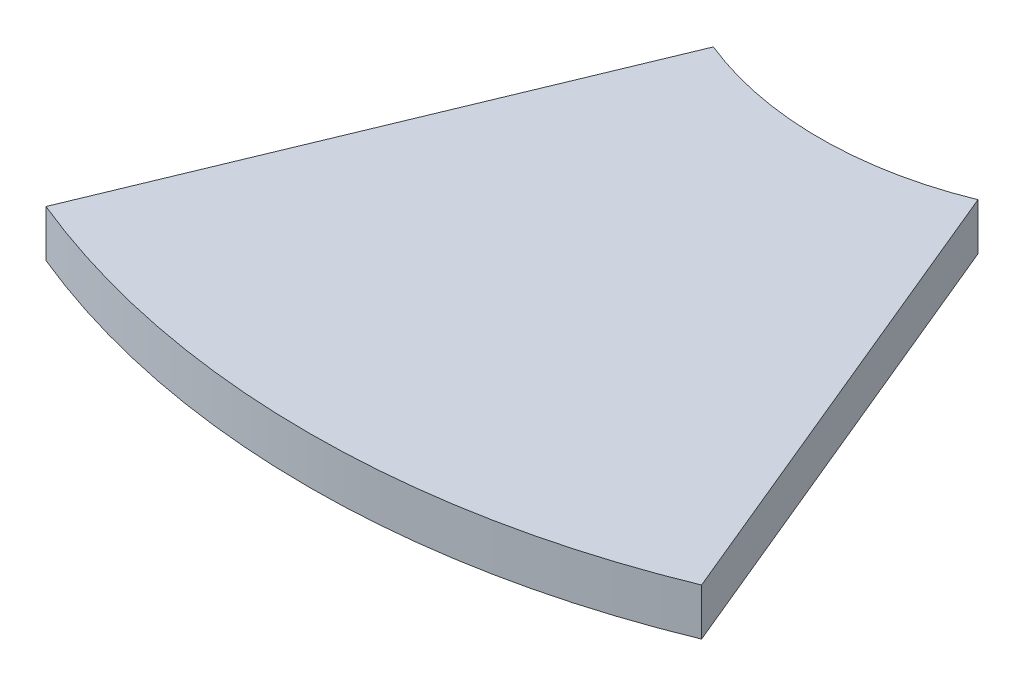
ISO-10303-21;
HEADER;
FILE_DESCRIPTION(('STEP AP214'),'2;1');
FILE_NAME('part.step','',(''),(''),'','','');
FILE_SCHEMA(('AUTOMOTIVE_DESIGN { 1 0 10303 214 1 1 1 1 }'));
ENDSEC;
DATA;
#1=APPLICATION_CONTEXT('core data for automotive mechanical design processes');
#2=APPLICATION_PROTOCOL_DEFINITION('international standard','automotive_design',2000,#1);
#3=PRODUCT_CONTEXT('',#1,'mechanical');
#4=PRODUCT('Part','Part','',(#3));
#5=PRODUCT_RELATED_PRODUCT_CATEGORY('part','',(#4));
#6=PRODUCT_DEFINITION_FORMATION('','',#4);
#7=PRODUCT_DEFINITION_CONTEXT('part definition',#1,'design');
#8=PRODUCT_DEFINITION('design','',#6,#7);
#9=PRODUCT_DEFINITION_SHAPE('','',#8);
#10=(LENGTH_UNIT() NAMED_UNIT(*) SI_UNIT(.MILLI.,.METRE.));
#11=(NAMED_UNIT(*) PLANE_ANGLE_UNIT() SI_UNIT($,.RADIAN.));
#12=(NAMED_UNIT(*) SI_UNIT($,.STERADIAN.) SOLID_ANGLE_UNIT());
#13=UNCERTAINTY_MEASURE_WITH_UNIT(LENGTH_MEASURE(1.E-05),#10,'distance_accuracy_value','');
#14=(GEOMETRIC_REPRESENTATION_CONTEXT(3) GLOBAL_UNCERTAINTY_ASSIGNED_CONTEXT((#13)) GLOBAL_UNIT_ASSIGNED_CONTEXT((#10,
#11,#12)) REPRESENTATION_CONTEXT('',''));
#15=CARTESIAN_POINT('',(0.,0.,0.));
#16=DIRECTION('',(0.,0.,1.));
#17=DIRECTION('',(1.,0.,0.));
#18=AXIS2_PLACEMENT_3D('',#15,#16,#17);
#19=CARTESIAN_POINT('',(0.,-0.00999999999999959,0.));
#20=DIRECTION('',(0.,1.,0.));
#21=DIRECTION('',(0.,0.,1.));
#22=AXIS2_PLACEMENT_3D('',#19,#20,#21);
#23=CYLINDRICAL_SURFACE('',#22,75.);
#24=CARTESIAN_POINT('',(0.,9.99,0.));
#25=DIRECTION('',(0.,1.,0.));
#26=DIRECTION('',(0.,0.,-1.));
#27=AXIS2_PLACEMENT_3D('',#24,#25,#26);
#28=CIRCLE('',#27,75.);
#29=CARTESIAN_POINT('',(-28.2386798483181,9.99,69.4807668381991));
#30=VERTEX_POINT('',#29);
#31=CARTESIAN_POINT('',(28.2386798483182,9.99,69.4807668381991));
#32=VERTEX_POINT('',#31);
#33=EDGE_CURVE('E96',#30,#32,#28,.T.);
#34=ORIENTED_EDGE('',*,*,#33,.T.);
#35=DIRECTION('',(0.,1.,0.));
#36=VECTOR('',#35,1.);
#37=CARTESIAN_POINT('',(28.2386798483182,-0.00999999999999959,69.4807668381991));
#38=LINE('',#37,#36);
#39=CARTESIAN_POINT('',(28.2386798483182,-0.00999999999999959,69.4807668381991));
#40=VERTEX_POINT('',#39);
#41=EDGE_CURVE('E11',#40,#32,#38,.T.);
#42=ORIENTED_EDGE('',*,*,#41,.F.);
#43=CARTESIAN_POINT('',(0.,-0.00999999999999959,0.));
#44=DIRECTION('',(0.,1.,0.));
#45=DIRECTION('',(0.,0.,-1.));
#46=AXIS2_PLACEMENT_3D('',#43,#44,#45);
#47=CIRCLE('',#46,75.);
#48=CARTESIAN_POINT('',(-28.2386798483181,-0.00999999999999959,69.4807668381991));
#49=VERTEX_POINT('',#48);
#50=EDGE_CURVE('E84',#49,#40,#47,.T.);
#51=ORIENTED_EDGE('',*,*,#50,.F.);
#52=DIRECTION('',(0.,1.,0.));
#53=VECTOR('',#52,1.);
#54=CARTESIAN_POINT('',(-28.2386798483181,-0.00999999999999959,69.4807668381991));
#55=LINE('',#54,#53);
#56=EDGE_CURVE('E92',#49,#30,#55,.T.);
#57=ORIENTED_EDGE('',*,*,#56,.T.);
#58=EDGE_LOOP('',(#34,#42,#51,#57));
#59=FACE_BOUND('',#58,.T.);
#60=ADVANCED_FACE('F33',(#59),#23,.F.);
#61=CARTESIAN_POINT('',(28.2386798483182,-0.00999999999999959,69.4807668381991));
#62=DIRECTION('',(-0.923879532511289,0.,0.382683432365084));
#63=DIRECTION('',(0.382683432365084,0.,0.923879532511289));
#64=AXIS2_PLACEMENT_3D('',#61,#62,#63);
#65=PLANE('',#64);
#66=DIRECTION('',(0.382683432365084,0.,0.923879532511289));
#67=VECTOR('',#66,1.);
#68=CARTESIAN_POINT('',(28.2386798483182,9.99,69.4807668381991));
#69=LINE('',#68,#67);
#70=CARTESIAN_POINT('',(69.9518117889198,9.99,170.18517569826));
#71=VERTEX_POINT('',#70);
#72=EDGE_CURVE('E88',#32,#71,#69,.T.);
#73=ORIENTED_EDGE('',*,*,#72,.T.);
#74=DIRECTION('',(0.,1.,0.));
#75=VECTOR('',#74,1.);
#76=CARTESIAN_POINT('',(69.9518117889198,-0.00999999999999959,170.18517569826));
#77=LINE('',#76,#75);
#78=CARTESIAN_POINT('',(69.9518117889198,-0.00999999999999959,170.18517569826));
#79=VERTEX_POINT('',#78);
#80=EDGE_CURVE('E41',#79,#71,#77,.T.);
#81=ORIENTED_EDGE('',*,*,#80,.F.);
#82=DIRECTION('',(0.382683432365084,0.,0.923879532511289));
#83=VECTOR('',#82,1.);
#84=CARTESIAN_POINT('',(28.2386798483182,-0.00999999999999959,69.4807668381991));
#85=LINE('',#84,#83);
#86=EDGE_CURVE('E79',#40,#79,#85,.T.);
#87=ORIENTED_EDGE('',*,*,#86,.F.);
#88=ORIENTED_EDGE('',*,*,#41,.T.);
#89=EDGE_LOOP('',(#73,#81,#87,#88));
#90=FACE_BOUND('',#89,.T.);
#91=ADVANCED_FACE('F87',(#90),#65,.F.);
#92=CARTESIAN_POINT('',(0.,-0.00999999999999959,0.));
#93=DIRECTION('',(0.,1.,0.));
#94=DIRECTION('',(0.,0.,1.));
#95=AXIS2_PLACEMENT_3D('',#92,#93,#94);
#96=CYLINDRICAL_SURFACE('',#95,184.000679346572);
#97=CARTESIAN_POINT('',(0.,9.99,0.));
#98=DIRECTION('',(0.,-1.,0.));
#99=DIRECTION('',(0.,0.,-1.));
#100=AXIS2_PLACEMENT_3D('',#97,#98,#99);
#101=CIRCLE('',#100,184.000679346572);
#102=CARTESIAN_POINT('',(-69.9518117889197,9.99,170.18517569826));
#103=VERTEX_POINT('',#102);
#104=EDGE_CURVE('E66',#71,#103,#101,.T.);
#105=ORIENTED_EDGE('',*,*,#104,.T.);
#106=DIRECTION('',(0.,1.,0.));
#107=VECTOR('',#106,1.);
#108=CARTESIAN_POINT('',(-69.9518117889197,-0.00999999999999959,170.18517569826));
#109=LINE('',#108,#107);
#110=CARTESIAN_POINT('',(-69.9518117889197,-0.00999999999999959,170.18517569826));
#111=VERTEX_POINT('',#110);
#112=EDGE_CURVE('E89',#111,#103,#109,.T.);
#113=ORIENTED_EDGE('',*,*,#112,.F.);
#114=CARTESIAN_POINT('',(0.,-0.00999999999999959,0.));
#115=DIRECTION('',(0.,-1.,0.));
#116=DIRECTION('',(0.,0.,-1.));
#117=AXIS2_PLACEMENT_3D('',#114,#115,#116);
#118=CIRCLE('',#117,184.000679346572);
#119=EDGE_CURVE('E82',#79,#111,#118,.T.);
#120=ORIENTED_EDGE('',*,*,#119,.F.);
#121=ORIENTED_EDGE('',*,*,#80,.T.);
#122=EDGE_LOOP('',(#105,#113,#120,#121));
#123=FACE_BOUND('',#122,.T.);
#124=ADVANCED_FACE('F90',(#123),#96,.T.);
#125=CARTESIAN_POINT('',(-28.2386798483181,-0.00999999999999959,69.4807668381991));
#126=DIRECTION('',(0.923879532511289,0.,0.382683432365084));
#127=DIRECTION('',(0.382683432365084,0.,-0.923879532511289));
#128=AXIS2_PLACEMENT_3D('',#125,#126,#127);
#129=PLANE('',#128);
#130=DIRECTION('',(0.382683432365084,0.,-0.923879532511289));
#131=VECTOR('',#130,1.);
#132=CARTESIAN_POINT('',(-28.2386798483181,9.99,69.4807668381991));
#133=LINE('',#132,#131);
#134=EDGE_CURVE('E72',#103,#30,#133,.T.);
#135=ORIENTED_EDGE('',*,*,#134,.T.);
#136=ORIENTED_EDGE('',*,*,#56,.F.);
#137=DIRECTION('',(0.382683432365084,0.,-0.923879532511289));
#138=VECTOR('',#137,1.);
#139=CARTESIAN_POINT('',(-28.2386798483181,-0.00999999999999959,69.4807668381991));
#140=LINE('',#139,#138);
#141=EDGE_CURVE('E49',#111,#49,#140,.T.);
#142=ORIENTED_EDGE('',*,*,#141,.F.);
#143=ORIENTED_EDGE('',*,*,#112,.T.);
#144=EDGE_LOOP('',(#135,#136,#142,#143));
#145=FACE_BOUND('',#144,.T.);
#146=ADVANCED_FACE('F103',(#145),#129,.F.);
#147=CARTESIAN_POINT('',(0.,-0.00999999999999959,0.));
#148=DIRECTION('',(0.,-1.,0.));
#149=DIRECTION('',(0.,0.,-1.));
#150=AXIS2_PLACEMENT_3D('',#147,#148,#149);
#151=PLANE('',#150);
#152=ORIENTED_EDGE('',*,*,#50,.T.);
#153=ORIENTED_EDGE('',*,*,#86,.T.);
#154=ORIENTED_EDGE('',*,*,#119,.T.);
#155=ORIENTED_EDGE('',*,*,#141,.T.);
#156=EDGE_LOOP('',(#152,#153,#154,#155));
#157=FACE_BOUND('',#156,.T.);
#158=ADVANCED_FACE('F80',(#157),#151,.T.);
#159=CARTESIAN_POINT('',(0.,9.99,0.));
#160=DIRECTION('',(0.,-1.,0.));
#161=DIRECTION('',(0.,0.,-1.));
#162=AXIS2_PLACEMENT_3D('',#159,#160,#161);
#163=PLANE('',#162);
#164=ORIENTED_EDGE('',*,*,#33,.F.);
#165=ORIENTED_EDGE('',*,*,#134,.F.);
#166=ORIENTED_EDGE('',*,*,#104,.F.);
#167=ORIENTED_EDGE('',*,*,#72,.F.);
#168=EDGE_LOOP('',(#164,#165,#166,#167));
#169=FACE_BOUND('',#168,.T.);
#170=ADVANCED_FACE('F106',(#169),#163,.F.);
#171=CLOSED_SHELL('',(#60,#91,#124,#146,#158,#170));
#172=MANIFOLD_SOLID_BREP('B2',#171);
#173=ADVANCED_BREP_SHAPE_REPRESENTATION('',(#18,#172),#14);
#174=SHAPE_DEFINITION_REPRESENTATION(#9,#173);
ENDSEC;
END-ISO-10303-21;
